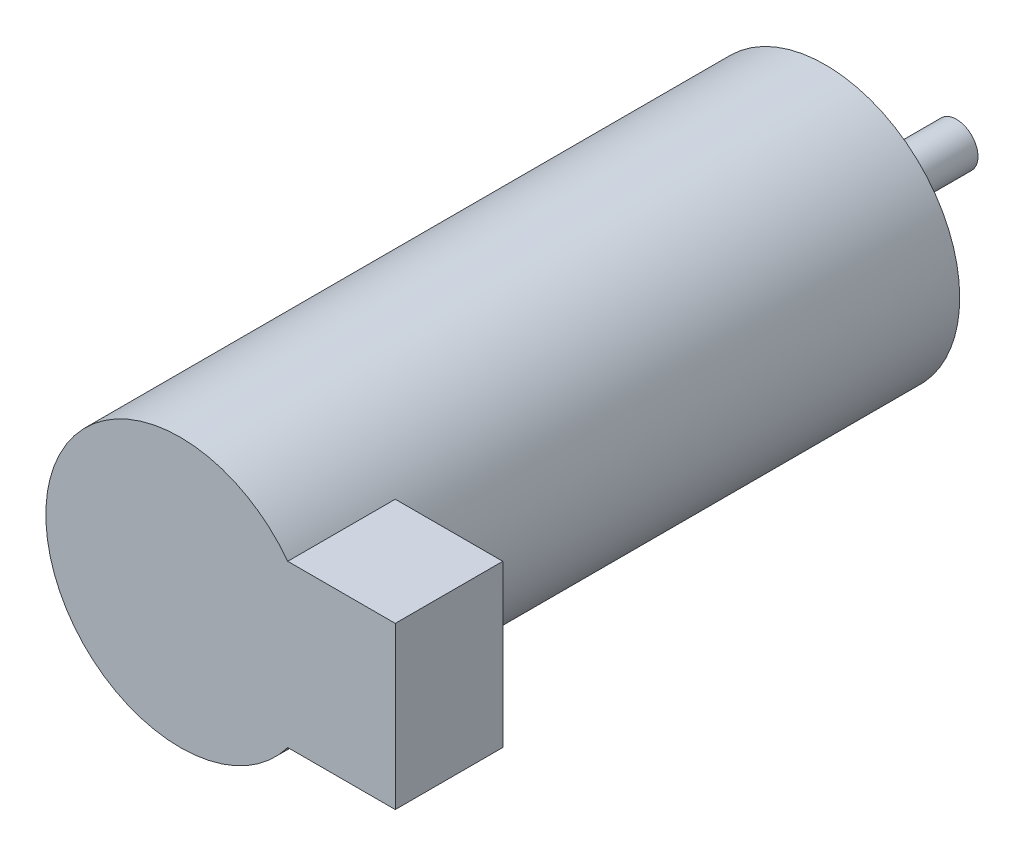
ISO-10303-21;
HEADER;
FILE_DESCRIPTION(('STEP AP214'),'2;1');
FILE_NAME('part.step','',(''),(''),'','','');
FILE_SCHEMA(('AUTOMOTIVE_DESIGN { 1 0 10303 214 1 1 1 1 }'));
ENDSEC;
DATA;
#1=APPLICATION_CONTEXT('core data for automotive mechanical design processes');
#2=APPLICATION_PROTOCOL_DEFINITION('international standard','automotive_design',2000,#1);
#3=PRODUCT_CONTEXT('',#1,'mechanical');
#4=PRODUCT('Part','Part','',(#3));
#5=PRODUCT_RELATED_PRODUCT_CATEGORY('part','',(#4));
#6=PRODUCT_DEFINITION_FORMATION('','',#4);
#7=PRODUCT_DEFINITION_CONTEXT('part definition',#1,'design');
#8=PRODUCT_DEFINITION('design','',#6,#7);
#9=PRODUCT_DEFINITION_SHAPE('','',#8);
#10=(LENGTH_UNIT() NAMED_UNIT(*) SI_UNIT(.MILLI.,.METRE.));
#11=(NAMED_UNIT(*) PLANE_ANGLE_UNIT() SI_UNIT($,.RADIAN.));
#12=(NAMED_UNIT(*) SI_UNIT($,.STERADIAN.) SOLID_ANGLE_UNIT());
#13=UNCERTAINTY_MEASURE_WITH_UNIT(LENGTH_MEASURE(1.E-05),#10,'distance_accuracy_value','');
#14=(GEOMETRIC_REPRESENTATION_CONTEXT(3) GLOBAL_UNCERTAINTY_ASSIGNED_CONTEXT((#13)) GLOBAL_UNIT_ASSIGNED_CONTEXT((#10,
#11,#12)) REPRESENTATION_CONTEXT('',''));
#15=CARTESIAN_POINT('',(0.,0.,0.));
#16=DIRECTION('',(0.,0.,1.));
#17=DIRECTION('',(1.,0.,0.));
#18=AXIS2_PLACEMENT_3D('',#15,#16,#17);
#19=CARTESIAN_POINT('',(0.,0.,60.));
#20=DIRECTION('',(0.,0.,-1.));
#21=DIRECTION('',(-1.,0.,0.));
#22=AXIS2_PLACEMENT_3D('',#19,#20,#21);
#23=CYLINDRICAL_SURFACE('',#22,12.5);
#24=CARTESIAN_POINT('',(0.,0.,0.));
#25=DIRECTION('',(0.,0.,1.));
#26=DIRECTION('',(1.,0.,0.));
#27=AXIS2_PLACEMENT_3D('',#24,#25,#26);
#28=CIRCLE('',#27,12.5);
#29=CARTESIAN_POINT('',(12.5,0.,0.));
#30=VERTEX_POINT('',#29);
#31=EDGE_CURVE('E120',#30,#30,#28,.T.);
#32=ORIENTED_EDGE('',*,*,#31,.T.);
#33=EDGE_LOOP('',(#32));
#34=FACE_BOUND('',#33,.T.);
#35=DIRECTION('',(0.,0.,-1.));
#36=VECTOR('',#35,1.);
#37=CARTESIAN_POINT('',(10.,-7.5,60.));
#38=LINE('',#37,#36);
#39=CARTESIAN_POINT('',(10.,-7.5,60.));
#40=VERTEX_POINT('',#39);
#41=CARTESIAN_POINT('',(10.,-7.5,50.));
#42=VERTEX_POINT('',#41);
#43=EDGE_CURVE('E97',#40,#42,#38,.T.);
#44=ORIENTED_EDGE('',*,*,#43,.F.);
#45=CARTESIAN_POINT('',(0.,0.,60.));
#46=DIRECTION('',(0.,0.,1.));
#47=DIRECTION('',(1.,0.,0.));
#48=AXIS2_PLACEMENT_3D('',#45,#46,#47);
#49=CIRCLE('',#48,12.5);
#50=CARTESIAN_POINT('',(10.,7.5,60.));
#51=VERTEX_POINT('',#50);
#52=EDGE_CURVE('E45',#51,#40,#49,.T.);
#53=ORIENTED_EDGE('',*,*,#52,.F.);
#54=DIRECTION('',(0.,0.,-1.));
#55=VECTOR('',#54,1.);
#56=CARTESIAN_POINT('',(10.,7.5,60.));
#57=LINE('',#56,#55);
#58=CARTESIAN_POINT('',(10.,7.5,50.));
#59=VERTEX_POINT('',#58);
#60=EDGE_CURVE('E55',#59,#51,#57,.F.);
#61=ORIENTED_EDGE('',*,*,#60,.F.);
#62=CARTESIAN_POINT('',(0.,0.,50.));
#63=DIRECTION('',(0.,0.,1.));
#64=DIRECTION('',(1.,0.,0.));
#65=AXIS2_PLACEMENT_3D('',#62,#63,#64);
#66=CIRCLE('',#65,12.5);
#67=EDGE_CURVE('E11',#42,#59,#66,.T.);
#68=ORIENTED_EDGE('',*,*,#67,.F.);
#69=EDGE_LOOP('',(#44,#53,#61,#68));
#70=FACE_BOUND('',#69,.T.);
#71=ADVANCED_FACE('F38',(#34,#70),#23,.T.);
#72=CARTESIAN_POINT('',(0.,0.,60.));
#73=DIRECTION('',(0.,0.,1.));
#74=DIRECTION('',(1.,0.,0.));
#75=AXIS2_PLACEMENT_3D('',#72,#73,#74);
#76=PLANE('',#75);
#77=ORIENTED_EDGE('',*,*,#52,.T.);
#78=DIRECTION('',(-1.,0.,0.));
#79=VECTOR('',#78,1.);
#80=CARTESIAN_POINT('',(20.,-7.5,60.));
#81=LINE('',#80,#79);
#82=CARTESIAN_POINT('',(20.,-7.5,60.));
#83=VERTEX_POINT('',#82);
#84=EDGE_CURVE('E78',#83,#40,#81,.T.);
#85=ORIENTED_EDGE('',*,*,#84,.F.);
#86=DIRECTION('',(0.,-1.,0.));
#87=VECTOR('',#86,1.);
#88=CARTESIAN_POINT('',(20.,7.5,60.));
#89=LINE('',#88,#87);
#90=CARTESIAN_POINT('',(20.,7.5,60.));
#91=VERTEX_POINT('',#90);
#92=EDGE_CURVE('E84',#91,#83,#89,.T.);
#93=ORIENTED_EDGE('',*,*,#92,.F.);
#94=DIRECTION('',(-1.,0.,0.));
#95=VECTOR('',#94,1.);
#96=CARTESIAN_POINT('',(20.,7.5,60.));
#97=LINE('',#96,#95);
#98=EDGE_CURVE('E324',#91,#51,#97,.T.);
#99=ORIENTED_EDGE('',*,*,#98,.T.);
#100=EDGE_LOOP('',(#77,#85,#93,#99));
#101=FACE_BOUND('',#100,.T.);
#102=ADVANCED_FACE('F95',(#101),#76,.T.);
#103=CARTESIAN_POINT('',(0.,0.,0.));
#104=DIRECTION('',(0.,0.,1.));
#105=DIRECTION('',(1.,0.,0.));
#106=AXIS2_PLACEMENT_3D('',#103,#104,#105);
#107=PLANE('',#106);
#108=CARTESIAN_POINT('',(0.,0.,0.));
#109=DIRECTION('',(0.,0.,1.));
#110=DIRECTION('',(1.,0.,0.));
#111=AXIS2_PLACEMENT_3D('',#108,#109,#110);
#112=CIRCLE('',#111,3.5);
#113=CARTESIAN_POINT('',(3.5,0.,0.));
#114=VERTEX_POINT('',#113);
#115=EDGE_CURVE('E110',#114,#114,#112,.T.);
#116=ORIENTED_EDGE('',*,*,#115,.T.);
#117=EDGE_LOOP('',(#116));
#118=FACE_BOUND('',#117,.T.);
#119=CARTESIAN_POINT('',(8.5,0.,0.));
#120=DIRECTION('',(0.,0.,1.));
#121=DIRECTION('',(1.,0.,0.));
#122=AXIS2_PLACEMENT_3D('',#119,#120,#121);
#123=CIRCLE('',#122,1.5);
#124=CARTESIAN_POINT('',(10.,0.,0.));
#125=VERTEX_POINT('',#124);
#126=EDGE_CURVE('E121',#125,#125,#123,.T.);
#127=ORIENTED_EDGE('',*,*,#126,.T.);
#128=EDGE_LOOP('',(#127));
#129=FACE_BOUND('',#128,.T.);
#130=CARTESIAN_POINT('',(-8.5,0.,0.));
#131=DIRECTION('',(0.,0.,1.));
#132=DIRECTION('',(1.,0.,0.));
#133=AXIS2_PLACEMENT_3D('',#130,#131,#132);
#134=CIRCLE('',#133,1.5);
#135=CARTESIAN_POINT('',(-7.,0.,0.));
#136=VERTEX_POINT('',#135);
#137=EDGE_CURVE('E124',#136,#136,#134,.T.);
#138=ORIENTED_EDGE('',*,*,#137,.T.);
#139=EDGE_LOOP('',(#138));
#140=FACE_BOUND('',#139,.T.);
#141=ORIENTED_EDGE('',*,*,#31,.F.);
#142=EDGE_LOOP('',(#141));
#143=FACE_BOUND('',#142,.T.);
#144=ADVANCED_FACE('F133',(#118,#129,#140,#143),#107,.F.);
#145=CARTESIAN_POINT('',(-8.5,0.,3.5));
#146=DIRECTION('',(0.,0.,-1.));
#147=DIRECTION('',(-1.,0.,0.));
#148=AXIS2_PLACEMENT_3D('',#145,#146,#147);
#149=CYLINDRICAL_SURFACE('',#148,1.5);
#150=CARTESIAN_POINT('',(-8.5,0.,3.5));
#151=DIRECTION('',(0.,0.,1.));
#152=DIRECTION('',(1.,0.,0.));
#153=AXIS2_PLACEMENT_3D('',#150,#151,#152);
#154=CIRCLE('',#153,1.5);
#155=CARTESIAN_POINT('',(-7.,0.,3.5));
#156=VERTEX_POINT('',#155);
#157=EDGE_CURVE('E114',#156,#156,#154,.T.);
#158=ORIENTED_EDGE('',*,*,#157,.T.);
#159=EDGE_LOOP('',(#158));
#160=FACE_BOUND('',#159,.T.);
#161=ORIENTED_EDGE('',*,*,#137,.F.);
#162=EDGE_LOOP('',(#161));
#163=FACE_BOUND('',#162,.T.);
#164=ADVANCED_FACE('F135',(#160,#163),#149,.F.);
#165=CARTESIAN_POINT('',(-8.5,0.,3.5));
#166=DIRECTION('',(0.,0.,1.));
#167=DIRECTION('',(1.,0.,0.));
#168=AXIS2_PLACEMENT_3D('',#165,#166,#167);
#169=PLANE('',#168);
#170=ORIENTED_EDGE('',*,*,#157,.F.);
#171=EDGE_LOOP('',(#170));
#172=FACE_BOUND('',#171,.T.);
#173=ADVANCED_FACE('F141',(#172),#169,.F.);
#174=CARTESIAN_POINT('',(8.5,0.,3.5));
#175=DIRECTION('',(0.,0.,-1.));
#176=DIRECTION('',(-1.,0.,0.));
#177=AXIS2_PLACEMENT_3D('',#174,#175,#176);
#178=CYLINDRICAL_SURFACE('',#177,1.5);
#179=CARTESIAN_POINT('',(8.5,0.,3.5));
#180=DIRECTION('',(0.,0.,1.));
#181=DIRECTION('',(1.,0.,0.));
#182=AXIS2_PLACEMENT_3D('',#179,#180,#181);
#183=CIRCLE('',#182,1.5);
#184=CARTESIAN_POINT('',(10.,0.,3.5));
#185=VERTEX_POINT('',#184);
#186=EDGE_CURVE('E117',#185,#185,#183,.T.);
#187=ORIENTED_EDGE('',*,*,#186,.T.);
#188=EDGE_LOOP('',(#187));
#189=FACE_BOUND('',#188,.T.);
#190=ORIENTED_EDGE('',*,*,#126,.F.);
#191=EDGE_LOOP('',(#190));
#192=FACE_BOUND('',#191,.T.);
#193=ADVANCED_FACE('F252',(#189,#192),#178,.F.);
#194=CARTESIAN_POINT('',(8.5,0.,3.5));
#195=DIRECTION('',(0.,0.,1.));
#196=DIRECTION('',(1.,0.,0.));
#197=AXIS2_PLACEMENT_3D('',#194,#195,#196);
#198=PLANE('',#197);
#199=ORIENTED_EDGE('',*,*,#186,.F.);
#200=EDGE_LOOP('',(#199));
#201=FACE_BOUND('',#200,.T.);
#202=ADVANCED_FACE('F242',(#201),#198,.F.);
#203=CARTESIAN_POINT('',(0.,0.,-2.5));
#204=DIRECTION('',(0.,0.,1.));
#205=DIRECTION('',(1.,0.,0.));
#206=AXIS2_PLACEMENT_3D('',#203,#204,#205);
#207=CYLINDRICAL_SURFACE('',#206,3.5);
#208=CARTESIAN_POINT('',(0.,0.,-2.5));
#209=DIRECTION('',(0.,0.,1.));
#210=DIRECTION('',(1.,0.,0.));
#211=AXIS2_PLACEMENT_3D('',#208,#209,#210);
#212=CIRCLE('',#211,3.5);
#213=CARTESIAN_POINT('',(3.5,0.,-2.5));
#214=VERTEX_POINT('',#213);
#215=EDGE_CURVE('E111',#214,#214,#212,.T.);
#216=ORIENTED_EDGE('',*,*,#215,.T.);
#217=EDGE_LOOP('',(#216));
#218=FACE_BOUND('',#217,.T.);
#219=ORIENTED_EDGE('',*,*,#115,.F.);
#220=EDGE_LOOP('',(#219));
#221=FACE_BOUND('',#220,.T.);
#222=ADVANCED_FACE('F232',(#218,#221),#207,.T.);
#223=CARTESIAN_POINT('',(0.,0.,-2.5));
#224=DIRECTION('',(0.,0.,1.));
#225=DIRECTION('',(1.,0.,0.));
#226=AXIS2_PLACEMENT_3D('',#223,#224,#225);
#227=PLANE('',#226);
#228=CARTESIAN_POINT('',(0.,0.,-2.5));
#229=DIRECTION('',(0.,0.,1.));
#230=DIRECTION('',(1.,0.,0.));
#231=AXIS2_PLACEMENT_3D('',#228,#229,#230);
#232=CIRCLE('',#231,2.);
#233=CARTESIAN_POINT('',(2.,0.,-2.5));
#234=VERTEX_POINT('',#233);
#235=EDGE_CURVE('E107',#234,#234,#232,.T.);
#236=ORIENTED_EDGE('',*,*,#235,.T.);
#237=EDGE_LOOP('',(#236));
#238=FACE_BOUND('',#237,.T.);
#239=ORIENTED_EDGE('',*,*,#215,.F.);
#240=EDGE_LOOP('',(#239));
#241=FACE_BOUND('',#240,.T.);
#242=ADVANCED_FACE('F222',(#238,#241),#227,.F.);
#243=CARTESIAN_POINT('',(0.,0.,-12.2));
#244=DIRECTION('',(0.,0.,1.));
#245=DIRECTION('',(1.,0.,0.));
#246=AXIS2_PLACEMENT_3D('',#243,#244,#245);
#247=CYLINDRICAL_SURFACE('',#246,2.);
#248=CARTESIAN_POINT('',(0.,0.,-12.2));
#249=DIRECTION('',(0.,0.,1.));
#250=DIRECTION('',(1.,0.,0.));
#251=AXIS2_PLACEMENT_3D('',#248,#249,#250);
#252=CIRCLE('',#251,2.);
#253=CARTESIAN_POINT('',(2.,0.,-12.2));
#254=VERTEX_POINT('',#253);
#255=EDGE_CURVE('E104',#254,#254,#252,.T.);
#256=ORIENTED_EDGE('',*,*,#255,.T.);
#257=EDGE_LOOP('',(#256));
#258=FACE_BOUND('',#257,.T.);
#259=ORIENTED_EDGE('',*,*,#235,.F.);
#260=EDGE_LOOP('',(#259));
#261=FACE_BOUND('',#260,.T.);
#262=ADVANCED_FACE('F213',(#258,#261),#247,.T.);
#263=CARTESIAN_POINT('',(0.,0.,-12.2));
#264=DIRECTION('',(0.,0.,1.));
#265=DIRECTION('',(1.,0.,0.));
#266=AXIS2_PLACEMENT_3D('',#263,#264,#265);
#267=PLANE('',#266);
#268=ORIENTED_EDGE('',*,*,#255,.F.);
#269=EDGE_LOOP('',(#268));
#270=FACE_BOUND('',#269,.T.);
#271=ADVANCED_FACE('F166',(#270),#267,.F.);
#272=CARTESIAN_POINT('',(20.,-7.5,60.));
#273=DIRECTION('',(0.,1.,0.));
#274=DIRECTION('',(0.,0.,1.));
#275=AXIS2_PLACEMENT_3D('',#272,#273,#274);
#276=PLANE('',#275);
#277=ORIENTED_EDGE('',*,*,#84,.T.);
#278=ORIENTED_EDGE('',*,*,#43,.T.);
#279=DIRECTION('',(-1.,0.,0.));
#280=VECTOR('',#279,1.);
#281=CARTESIAN_POINT('',(20.,-7.5,50.));
#282=LINE('',#281,#280);
#283=CARTESIAN_POINT('',(20.,-7.5,50.));
#284=VERTEX_POINT('',#283);
#285=EDGE_CURVE('E80',#284,#42,#282,.T.);
#286=ORIENTED_EDGE('',*,*,#285,.F.);
#287=DIRECTION('',(0.,0.,-1.));
#288=VECTOR('',#287,1.);
#289=CARTESIAN_POINT('',(20.,-7.5,60.));
#290=LINE('',#289,#288);
#291=EDGE_CURVE('E74',#83,#284,#290,.T.);
#292=ORIENTED_EDGE('',*,*,#291,.F.);
#293=EDGE_LOOP('',(#277,#278,#286,#292));
#294=FACE_BOUND('',#293,.T.);
#295=ADVANCED_FACE('F76',(#294),#276,.F.);
#296=CARTESIAN_POINT('',(20.,7.5,60.));
#297=DIRECTION('',(0.,-1.,0.));
#298=DIRECTION('',(0.,0.,-1.));
#299=AXIS2_PLACEMENT_3D('',#296,#297,#298);
#300=PLANE('',#299);
#301=DIRECTION('',(-1.,0.,0.));
#302=VECTOR('',#301,1.);
#303=CARTESIAN_POINT('',(20.,7.5,50.));
#304=LINE('',#303,#302);
#305=CARTESIAN_POINT('',(20.,7.5,50.));
#306=VERTEX_POINT('',#305);
#307=EDGE_CURVE('E99',#306,#59,#304,.T.);
#308=ORIENTED_EDGE('',*,*,#307,.T.);
#309=ORIENTED_EDGE('',*,*,#60,.T.);
#310=ORIENTED_EDGE('',*,*,#98,.F.);
#311=DIRECTION('',(0.,0.,1.));
#312=VECTOR('',#311,1.);
#313=CARTESIAN_POINT('',(20.,7.5,60.));
#314=LINE('',#313,#312);
#315=EDGE_CURVE('E89',#306,#91,#314,.T.);
#316=ORIENTED_EDGE('',*,*,#315,.F.);
#317=EDGE_LOOP('',(#308,#309,#310,#316));
#318=FACE_BOUND('',#317,.T.);
#319=ADVANCED_FACE('F165',(#318),#300,.F.);
#320=CARTESIAN_POINT('',(20.,7.5,50.));
#321=DIRECTION('',(0.,0.,1.));
#322=DIRECTION('',(1.,0.,0.));
#323=AXIS2_PLACEMENT_3D('',#320,#321,#322);
#324=PLANE('',#323);
#325=ORIENTED_EDGE('',*,*,#285,.T.);
#326=ORIENTED_EDGE('',*,*,#67,.T.);
#327=ORIENTED_EDGE('',*,*,#307,.F.);
#328=DIRECTION('',(0.,1.,0.));
#329=VECTOR('',#328,1.);
#330=CARTESIAN_POINT('',(20.,7.5,50.));
#331=LINE('',#330,#329);
#332=EDGE_CURVE('E83',#284,#306,#331,.T.);
#333=ORIENTED_EDGE('',*,*,#332,.F.);
#334=EDGE_LOOP('',(#325,#326,#327,#333));
#335=FACE_BOUND('',#334,.T.);
#336=ADVANCED_FACE('F177',(#335),#324,.F.);
#337=CARTESIAN_POINT('',(20.,0.,0.));
#338=DIRECTION('',(1.,0.,0.));
#339=DIRECTION('',(0.,0.,-1.));
#340=AXIS2_PLACEMENT_3D('',#337,#338,#339);
#341=PLANE('',#340);
#342=ORIENTED_EDGE('',*,*,#92,.T.);
#343=ORIENTED_EDGE('',*,*,#291,.T.);
#344=ORIENTED_EDGE('',*,*,#332,.T.);
#345=ORIENTED_EDGE('',*,*,#315,.T.);
#346=EDGE_LOOP('',(#342,#343,#344,#345));
#347=FACE_BOUND('',#346,.T.);
#348=ADVANCED_FACE('F87',(#347),#341,.T.);
#349=CLOSED_SHELL('',(#71,#102,#144,#164,#173,#193,#202,#222,#242,#262,#271,#295,#319,#336,#348));
#350=MANIFOLD_SOLID_BREP('B2',#349);
#351=ADVANCED_BREP_SHAPE_REPRESENTATION('',(#18,#350),#14);
#352=SHAPE_DEFINITION_REPRESENTATION(#9,#351);
ENDSEC;
END-ISO-10303-21;
